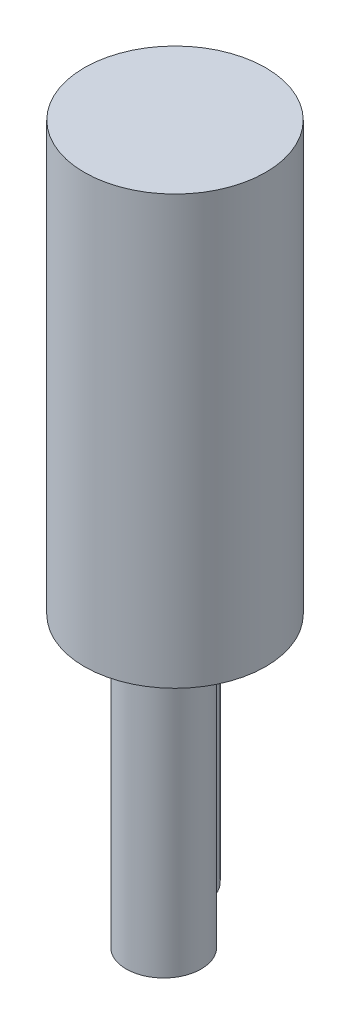
ISO-10303-21;
HEADER;
FILE_DESCRIPTION(('STEP AP214'),'2;1');
FILE_NAME('part.step','',(''),(''),'','','');
FILE_SCHEMA(('AUTOMOTIVE_DESIGN { 1 0 10303 214 1 1 1 1 }'));
ENDSEC;
DATA;
#1=APPLICATION_CONTEXT('core data for automotive mechanical design processes');
#2=APPLICATION_PROTOCOL_DEFINITION('international standard','automotive_design',2000,#1);
#3=PRODUCT_CONTEXT('',#1,'mechanical');
#4=PRODUCT('Part','Part','',(#3));
#5=PRODUCT_RELATED_PRODUCT_CATEGORY('part','',(#4));
#6=PRODUCT_DEFINITION_FORMATION('','',#4);
#7=PRODUCT_DEFINITION_CONTEXT('part definition',#1,'design');
#8=PRODUCT_DEFINITION('design','',#6,#7);
#9=PRODUCT_DEFINITION_SHAPE('','',#8);
#10=(LENGTH_UNIT() NAMED_UNIT(*) SI_UNIT(.MILLI.,.METRE.));
#11=(NAMED_UNIT(*) PLANE_ANGLE_UNIT() SI_UNIT($,.RADIAN.));
#12=(NAMED_UNIT(*) SI_UNIT($,.STERADIAN.) SOLID_ANGLE_UNIT());
#13=UNCERTAINTY_MEASURE_WITH_UNIT(LENGTH_MEASURE(1.E-05),#10,'distance_accuracy_value','');
#14=(GEOMETRIC_REPRESENTATION_CONTEXT(3) GLOBAL_UNCERTAINTY_ASSIGNED_CONTEXT((#13)) GLOBAL_UNIT_ASSIGNED_CONTEXT((#10,
#11,#12)) REPRESENTATION_CONTEXT('',''));
#15=CARTESIAN_POINT('',(0.,0.,0.));
#16=DIRECTION('',(0.,0.,1.));
#17=DIRECTION('',(1.,0.,0.));
#18=AXIS2_PLACEMENT_3D('',#15,#16,#17);
#19=CARTESIAN_POINT('',(0.,800.,0.));
#20=DIRECTION('',(0.,-1.,0.));
#21=DIRECTION('',(0.,0.,-1.));
#22=AXIS2_PLACEMENT_3D('',#19,#20,#21);
#23=CYLINDRICAL_SURFACE('',#22,169.5);
#24=CARTESIAN_POINT('',(0.,800.,0.));
#25=DIRECTION('',(0.,1.,0.));
#26=DIRECTION('',(0.,0.,1.));
#27=AXIS2_PLACEMENT_3D('',#24,#25,#26);
#28=CIRCLE('',#27,169.5);
#29=CARTESIAN_POINT('',(0.,800.,169.5));
#30=VERTEX_POINT('',#29);
#31=EDGE_CURVE('E51',#30,#30,#28,.T.);
#32=ORIENTED_EDGE('',*,*,#31,.F.);
#33=EDGE_LOOP('',(#32));
#34=FACE_BOUND('',#33,.T.);
#35=CARTESIAN_POINT('',(0.,0.,0.));
#36=DIRECTION('',(0.,1.,0.));
#37=DIRECTION('',(0.,0.,1.));
#38=AXIS2_PLACEMENT_3D('',#35,#36,#37);
#39=CIRCLE('',#38,169.5);
#40=CARTESIAN_POINT('',(0.,0.,169.5));
#41=VERTEX_POINT('',#40);
#42=EDGE_CURVE('E56',#41,#41,#39,.T.);
#43=ORIENTED_EDGE('',*,*,#42,.T.);
#44=EDGE_LOOP('',(#43));
#45=FACE_BOUND('',#44,.T.);
#46=ADVANCED_FACE('F41',(#34,#45),#23,.T.);
#47=CARTESIAN_POINT('',(0.,800.,0.));
#48=DIRECTION('',(0.,1.,0.));
#49=DIRECTION('',(0.,0.,1.));
#50=AXIS2_PLACEMENT_3D('',#47,#48,#49);
#51=PLANE('',#50);
#52=ORIENTED_EDGE('',*,*,#31,.T.);
#53=EDGE_LOOP('',(#52));
#54=FACE_BOUND('',#53,.T.);
#55=ADVANCED_FACE('F85',(#54),#51,.T.);
#56=CARTESIAN_POINT('',(0.,0.,0.));
#57=DIRECTION('',(0.,1.,0.));
#58=DIRECTION('',(0.,0.,1.));
#59=AXIS2_PLACEMENT_3D('',#56,#57,#58);
#60=PLANE('',#59);
#61=CARTESIAN_POINT('',(38.7538759956059,0.,59.9039652099586));
#62=DIRECTION('',(0.,1.,0.));
#63=DIRECTION('',(0.,0.,1.));
#64=AXIS2_PLACEMENT_3D('',#61,#62,#63);
#65=CIRCLE('',#64,69.9999999999992);
#66=CARTESIAN_POINT('',(38.7538759956059,0.,129.903965209958));
#67=VERTEX_POINT('',#66);
#68=EDGE_CURVE('E11',#67,#67,#65,.F.);
#69=ORIENTED_EDGE('',*,*,#68,.F.);
#70=EDGE_LOOP('',(#69));
#71=FACE_BOUND('',#70,.T.);
#72=CARTESIAN_POINT('',(-63.8718781514607,0.,-49.5584788108189));
#73=DIRECTION('',(0.,-1.,0.));
#74=DIRECTION('',(0.,0.,-1.));
#75=AXIS2_PLACEMENT_3D('',#72,#73,#74);
#76=CIRCLE('',#75,70.);
#77=CARTESIAN_POINT('',(-63.8718781514607,0.,-119.558478810819));
#78=VERTEX_POINT('',#77);
#79=EDGE_CURVE('E47',#78,#78,#76,.T.);
#80=ORIENTED_EDGE('',*,*,#79,.F.);
#81=EDGE_LOOP('',(#80));
#82=FACE_BOUND('',#81,.T.);
#83=ORIENTED_EDGE('',*,*,#42,.F.);
#84=EDGE_LOOP('',(#83));
#85=FACE_BOUND('',#84,.T.);
#86=ADVANCED_FACE('F90',(#71,#82,#85),#60,.F.);
#87=CARTESIAN_POINT('',(-63.8718781514607,-490.,-49.5584788108189));
#88=DIRECTION('',(0.,1.,0.));
#89=DIRECTION('',(0.,0.,1.));
#90=AXIS2_PLACEMENT_3D('',#87,#88,#89);
#91=CYLINDRICAL_SURFACE('',#90,70.);
#92=CARTESIAN_POINT('',(-63.8718781514607,-490.,-49.5584788108189));
#93=DIRECTION('',(0.,-1.,0.));
#94=DIRECTION('',(0.,0.,-1.));
#95=AXIS2_PLACEMENT_3D('',#92,#93,#94);
#96=CIRCLE('',#95,70.);
#97=CARTESIAN_POINT('',(-63.8718781514607,-490.,-119.558478810819));
#98=VERTEX_POINT('',#97);
#99=EDGE_CURVE('E59',#98,#98,#96,.T.);
#100=ORIENTED_EDGE('',*,*,#99,.F.);
#101=EDGE_LOOP('',(#100));
#102=FACE_BOUND('',#101,.T.);
#103=ORIENTED_EDGE('',*,*,#79,.T.);
#104=EDGE_LOOP('',(#103));
#105=FACE_BOUND('',#104,.T.);
#106=ADVANCED_FACE('F82',(#102,#105),#91,.T.);
#107=CARTESIAN_POINT('',(-63.8718781514607,-490.,-49.5584788108189));
#108=DIRECTION('',(0.,-1.,0.));
#109=DIRECTION('',(0.,0.,-1.));
#110=AXIS2_PLACEMENT_3D('',#107,#108,#109);
#111=PLANE('',#110);
#112=ORIENTED_EDGE('',*,*,#99,.T.);
#113=EDGE_LOOP('',(#112));
#114=FACE_BOUND('',#113,.T.);
#115=ADVANCED_FACE('F75',(#114),#111,.T.);
#116=CARTESIAN_POINT('',(38.7538759956059,-490.,59.9039652099586));
#117=DIRECTION('',(0.,1.,0.));
#118=DIRECTION('',(0.,0.,1.));
#119=AXIS2_PLACEMENT_3D('',#116,#117,#118);
#120=CYLINDRICAL_SURFACE('',#119,69.9999999999992);
#121=CARTESIAN_POINT('',(38.7538759956059,-490.,59.9039652099586));
#122=DIRECTION('',(0.,-1.,0.));
#123=DIRECTION('',(0.,0.,-1.));
#124=AXIS2_PLACEMENT_3D('',#121,#122,#123);
#125=CIRCLE('',#124,69.9999999999992);
#126=CARTESIAN_POINT('',(38.7538759956059,-490.,-10.0960347900406));
#127=VERTEX_POINT('',#126);
#128=EDGE_CURVE('E65',#127,#127,#125,.T.);
#129=ORIENTED_EDGE('',*,*,#128,.F.);
#130=EDGE_LOOP('',(#129));
#131=FACE_BOUND('',#130,.T.);
#132=ORIENTED_EDGE('',*,*,#68,.T.);
#133=EDGE_LOOP('',(#132));
#134=FACE_BOUND('',#133,.T.);
#135=ADVANCED_FACE('F73',(#131,#134),#120,.T.);
#136=CARTESIAN_POINT('',(38.7538759956059,-490.,59.9039652099586));
#137=DIRECTION('',(0.,-1.,0.));
#138=DIRECTION('',(0.,0.,-1.));
#139=AXIS2_PLACEMENT_3D('',#136,#137,#138);
#140=PLANE('',#139);
#141=ORIENTED_EDGE('',*,*,#128,.T.);
#142=EDGE_LOOP('',(#141));
#143=FACE_BOUND('',#142,.T.);
#144=ADVANCED_FACE('F71',(#143),#140,.T.);
#145=CLOSED_SHELL('',(#46,#55,#86,#106,#115,#135,#144));
#146=MANIFOLD_SOLID_BREP('B2',#145);
#147=ADVANCED_BREP_SHAPE_REPRESENTATION('',(#18,#146),#14);
#148=SHAPE_DEFINITION_REPRESENTATION(#9,#147);
ENDSEC;
END-ISO-10303-21;
